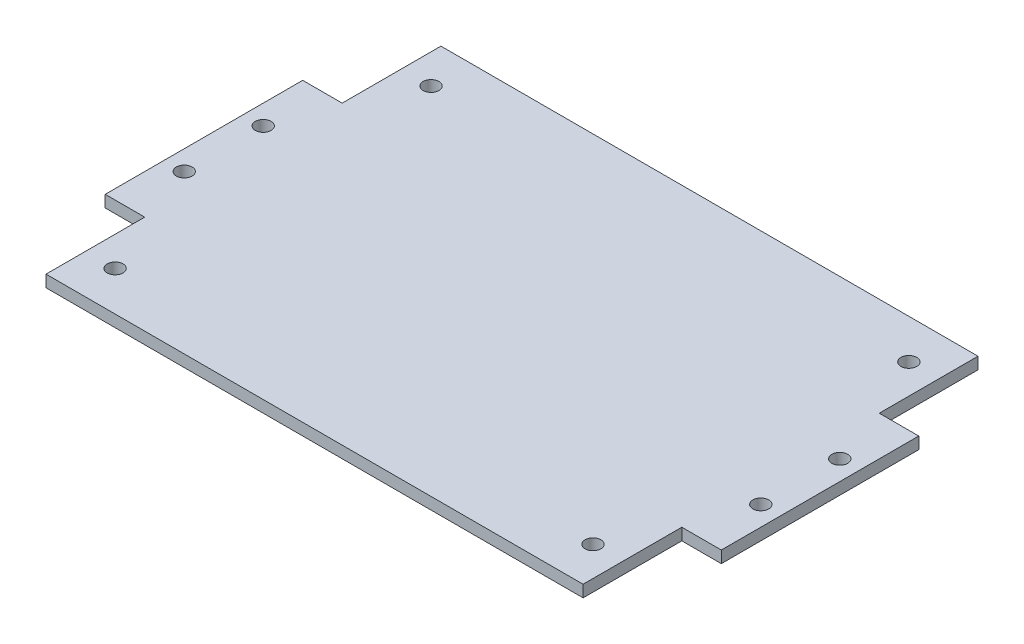
ISO-10303-21;
HEADER;
FILE_DESCRIPTION(('STEP AP214'),'2;1');
FILE_NAME('part.step','',(''),(''),'','','');
FILE_SCHEMA(('AUTOMOTIVE_DESIGN { 1 0 10303 214 1 1 1 1 }'));
ENDSEC;
DATA;
#1=APPLICATION_CONTEXT('core data for automotive mechanical design processes');
#2=APPLICATION_PROTOCOL_DEFINITION('international standard','automotive_design',2000,#1);
#3=PRODUCT_CONTEXT('',#1,'mechanical');
#4=PRODUCT('Part','Part','',(#3));
#5=PRODUCT_RELATED_PRODUCT_CATEGORY('part','',(#4));
#6=PRODUCT_DEFINITION_FORMATION('','',#4);
#7=PRODUCT_DEFINITION_CONTEXT('part definition',#1,'design');
#8=PRODUCT_DEFINITION('design','',#6,#7);
#9=PRODUCT_DEFINITION_SHAPE('','',#8);
#10=(LENGTH_UNIT() NAMED_UNIT(*) SI_UNIT(.MILLI.,.METRE.));
#11=(NAMED_UNIT(*) PLANE_ANGLE_UNIT() SI_UNIT($,.RADIAN.));
#12=(NAMED_UNIT(*) SI_UNIT($,.STERADIAN.) SOLID_ANGLE_UNIT());
#13=UNCERTAINTY_MEASURE_WITH_UNIT(LENGTH_MEASURE(1.E-05),#10,'distance_accuracy_value','');
#14=(GEOMETRIC_REPRESENTATION_CONTEXT(3) GLOBAL_UNCERTAINTY_ASSIGNED_CONTEXT((#13)) GLOBAL_UNIT_ASSIGNED_CONTEXT((#10,
#11,#12)) REPRESENTATION_CONTEXT('',''));
#15=CARTESIAN_POINT('',(0.,0.,0.));
#16=DIRECTION('',(0.,0.,1.));
#17=DIRECTION('',(1.,0.,0.));
#18=AXIS2_PLACEMENT_3D('',#15,#16,#17);
#19=CARTESIAN_POINT('',(-136.,3.,-100.));
#20=DIRECTION('',(1.,0.,0.));
#21=DIRECTION('',(0.,0.,-1.));
#22=AXIS2_PLACEMENT_3D('',#19,#20,#21);
#23=PLANE('',#22);
#24=DIRECTION('',(0.,1.,0.));
#25=VECTOR('',#24,1.);
#26=CARTESIAN_POINT('',(-136.,0.,-25.));
#27=LINE('',#26,#25);
#28=CARTESIAN_POINT('',(-136.,0.,-25.));
#29=VERTEX_POINT('',#28);
#30=CARTESIAN_POINT('',(-136.,3.,-25.));
#31=VERTEX_POINT('',#30);
#32=EDGE_CURVE('E152',#29,#31,#27,.T.);
#33=ORIENTED_EDGE('',*,*,#32,.F.);
#34=DIRECTION('',(0.,0.,1.));
#35=VECTOR('',#34,1.);
#36=CARTESIAN_POINT('',(-136.,0.,-100.));
#37=LINE('',#36,#35);
#38=CARTESIAN_POINT('',(-136.,0.,0.));
#39=VERTEX_POINT('',#38);
#40=EDGE_CURVE('E235',#29,#39,#37,.T.);
#41=ORIENTED_EDGE('',*,*,#40,.T.);
#42=DIRECTION('',(0.,-1.,0.));
#43=VECTOR('',#42,1.);
#44=CARTESIAN_POINT('',(-136.,3.,0.));
#45=LINE('',#44,#43);
#46=CARTESIAN_POINT('',(-136.,3.,0.));
#47=VERTEX_POINT('',#46);
#48=EDGE_CURVE('E11',#47,#39,#45,.T.);
#49=ORIENTED_EDGE('',*,*,#48,.F.);
#50=DIRECTION('',(0.,0.,1.));
#51=VECTOR('',#50,1.);
#52=CARTESIAN_POINT('',(-136.,3.,-100.));
#53=LINE('',#52,#51);
#54=EDGE_CURVE('E56',#31,#47,#53,.T.);
#55=ORIENTED_EDGE('',*,*,#54,.F.);
#56=EDGE_LOOP('',(#33,#41,#49,#55));
#57=FACE_BOUND('',#56,.T.);
#58=ADVANCED_FACE('F39',(#57),#23,.F.);
#59=DIRECTION('',(0.,-1.,0.));
#60=VECTOR('',#59,1.);
#61=CARTESIAN_POINT('',(-136.,0.,-75.));
#62=LINE('',#61,#60);
#63=CARTESIAN_POINT('',(-136.,3.,-75.));
#64=VERTEX_POINT('',#63);
#65=CARTESIAN_POINT('',(-136.,0.,-75.));
#66=VERTEX_POINT('',#65);
#67=EDGE_CURVE('E64',#64,#66,#62,.T.);
#68=ORIENTED_EDGE('',*,*,#67,.F.);
#69=CARTESIAN_POINT('',(-136.,3.,-100.));
#70=VERTEX_POINT('',#69);
#71=EDGE_CURVE('E155',#70,#64,#53,.T.);
#72=ORIENTED_EDGE('',*,*,#71,.F.);
#73=DIRECTION('',(0.,-1.,0.));
#74=VECTOR('',#73,1.);
#75=CARTESIAN_POINT('',(-136.,3.,-100.));
#76=LINE('',#75,#74);
#77=CARTESIAN_POINT('',(-136.,0.,-100.));
#78=VERTEX_POINT('',#77);
#79=EDGE_CURVE('E230',#70,#78,#76,.T.);
#80=ORIENTED_EDGE('',*,*,#79,.T.);
#81=EDGE_CURVE('E231',#78,#66,#37,.T.);
#82=ORIENTED_EDGE('',*,*,#81,.T.);
#83=EDGE_LOOP('',(#68,#72,#80,#82));
#84=FACE_BOUND('',#83,.T.);
#85=ADVANCED_FACE('F322',(#84),#23,.F.);
#86=CARTESIAN_POINT('',(0.,3.,-100.));
#87=DIRECTION('',(-1.,0.,0.));
#88=DIRECTION('',(0.,0.,1.));
#89=AXIS2_PLACEMENT_3D('',#86,#87,#88);
#90=PLANE('',#89);
#91=DIRECTION('',(0.,-1.,0.));
#92=VECTOR('',#91,1.);
#93=CARTESIAN_POINT('',(0.,0.,-25.));
#94=LINE('',#93,#92);
#95=CARTESIAN_POINT('',(0.,3.,-25.));
#96=VERTEX_POINT('',#95);
#97=CARTESIAN_POINT('',(0.,0.,-25.));
#98=VERTEX_POINT('',#97);
#99=EDGE_CURVE('E157',#96,#98,#94,.T.);
#100=ORIENTED_EDGE('',*,*,#99,.F.);
#101=DIRECTION('',(0.,0.,-1.));
#102=VECTOR('',#101,1.);
#103=CARTESIAN_POINT('',(0.,3.,-100.));
#104=LINE('',#103,#102);
#105=CARTESIAN_POINT('',(0.,3.,0.));
#106=VERTEX_POINT('',#105);
#107=EDGE_CURVE('E223',#106,#96,#104,.T.);
#108=ORIENTED_EDGE('',*,*,#107,.F.);
#109=DIRECTION('',(0.,-1.,0.));
#110=VECTOR('',#109,1.);
#111=CARTESIAN_POINT('',(0.,3.,0.));
#112=LINE('',#111,#110);
#113=CARTESIAN_POINT('',(0.,0.,0.));
#114=VERTEX_POINT('',#113);
#115=EDGE_CURVE('E48',#106,#114,#112,.T.);
#116=ORIENTED_EDGE('',*,*,#115,.T.);
#117=DIRECTION('',(0.,0.,-1.));
#118=VECTOR('',#117,1.);
#119=CARTESIAN_POINT('',(0.,0.,-100.));
#120=LINE('',#119,#118);
#121=EDGE_CURVE('E239',#114,#98,#120,.T.);
#122=ORIENTED_EDGE('',*,*,#121,.T.);
#123=EDGE_LOOP('',(#100,#108,#116,#122));
#124=FACE_BOUND('',#123,.T.);
#125=ADVANCED_FACE('F324',(#124),#90,.F.);
#126=DIRECTION('',(0.,1.,0.));
#127=VECTOR('',#126,1.);
#128=CARTESIAN_POINT('',(0.,0.,-75.));
#129=LINE('',#128,#127);
#130=CARTESIAN_POINT('',(0.,0.,-75.));
#131=VERTEX_POINT('',#130);
#132=CARTESIAN_POINT('',(0.,3.,-75.));
#133=VERTEX_POINT('',#132);
#134=EDGE_CURVE('E162',#131,#133,#129,.T.);
#135=ORIENTED_EDGE('',*,*,#134,.F.);
#136=CARTESIAN_POINT('',(0.,0.,-100.));
#137=VERTEX_POINT('',#136);
#138=EDGE_CURVE('E238',#131,#137,#120,.T.);
#139=ORIENTED_EDGE('',*,*,#138,.T.);
#140=DIRECTION('',(0.,-1.,0.));
#141=VECTOR('',#140,1.);
#142=CARTESIAN_POINT('',(0.,3.,-100.));
#143=LINE('',#142,#141);
#144=CARTESIAN_POINT('',(0.,3.,-100.));
#145=VERTEX_POINT('',#144);
#146=EDGE_CURVE('E248',#145,#137,#143,.T.);
#147=ORIENTED_EDGE('',*,*,#146,.F.);
#148=EDGE_CURVE('E222',#133,#145,#104,.T.);
#149=ORIENTED_EDGE('',*,*,#148,.F.);
#150=EDGE_LOOP('',(#135,#139,#147,#149));
#151=FACE_BOUND('',#150,.T.);
#152=ADVANCED_FACE('F317',(#151),#90,.F.);
#153=CARTESIAN_POINT('',(-136.,3.,0.));
#154=DIRECTION('',(0.,0.,-1.));
#155=DIRECTION('',(-1.,0.,0.));
#156=AXIS2_PLACEMENT_3D('',#153,#154,#155);
#157=PLANE('',#156);
#158=DIRECTION('',(1.,0.,0.));
#159=VECTOR('',#158,1.);
#160=CARTESIAN_POINT('',(-136.,0.,0.));
#161=LINE('',#160,#159);
#162=EDGE_CURVE('E234',#39,#114,#161,.T.);
#163=ORIENTED_EDGE('',*,*,#162,.T.);
#164=ORIENTED_EDGE('',*,*,#115,.F.);
#165=DIRECTION('',(1.,0.,0.));
#166=VECTOR('',#165,1.);
#167=CARTESIAN_POINT('',(-136.,3.,0.));
#168=LINE('',#167,#166);
#169=EDGE_CURVE('E219',#47,#106,#168,.T.);
#170=ORIENTED_EDGE('',*,*,#169,.F.);
#171=ORIENTED_EDGE('',*,*,#48,.T.);
#172=EDGE_LOOP('',(#163,#164,#170,#171));
#173=FACE_BOUND('',#172,.T.);
#174=ADVANCED_FACE('F375',(#173),#157,.F.);
#175=CARTESIAN_POINT('',(-136.,3.,-100.));
#176=DIRECTION('',(0.,0.,1.));
#177=DIRECTION('',(1.,0.,0.));
#178=AXIS2_PLACEMENT_3D('',#175,#176,#177);
#179=PLANE('',#178);
#180=DIRECTION('',(-1.,0.,0.));
#181=VECTOR('',#180,1.);
#182=CARTESIAN_POINT('',(-136.,0.,-100.));
#183=LINE('',#182,#181);
#184=EDGE_CURVE('E242',#137,#78,#183,.T.);
#185=ORIENTED_EDGE('',*,*,#184,.T.);
#186=ORIENTED_EDGE('',*,*,#79,.F.);
#187=DIRECTION('',(-1.,0.,0.));
#188=VECTOR('',#187,1.);
#189=CARTESIAN_POINT('',(-136.,3.,-100.));
#190=LINE('',#189,#188);
#191=EDGE_CURVE('E227',#145,#70,#190,.T.);
#192=ORIENTED_EDGE('',*,*,#191,.F.);
#193=ORIENTED_EDGE('',*,*,#146,.T.);
#194=EDGE_LOOP('',(#185,#186,#192,#193));
#195=FACE_BOUND('',#194,.T.);
#196=ADVANCED_FACE('F321',(#195),#179,.F.);
#197=CARTESIAN_POINT('',(0.,3.,0.));
#198=DIRECTION('',(0.,1.,0.));
#199=DIRECTION('',(0.,0.,1.));
#200=AXIS2_PLACEMENT_3D('',#197,#198,#199);
#201=PLANE('',#200);
#202=CARTESIAN_POINT('',(-141.,3.,-40.));
#203=DIRECTION('',(0.,1.,0.));
#204=DIRECTION('',(0.,0.,1.));
#205=AXIS2_PLACEMENT_3D('',#202,#203,#204);
#206=CIRCLE('',#205,2.);
#207=CARTESIAN_POINT('',(-141.,3.,-38.));
#208=VERTEX_POINT('',#207);
#209=EDGE_CURVE('E499',#208,#208,#206,.T.);
#210=ORIENTED_EDGE('',*,*,#209,.F.);
#211=EDGE_LOOP('',(#210));
#212=FACE_BOUND('',#211,.T.);
#213=CARTESIAN_POINT('',(-141.,3.,-60.));
#214=DIRECTION('',(0.,1.,0.));
#215=DIRECTION('',(0.,0.,1.));
#216=AXIS2_PLACEMENT_3D('',#213,#214,#215);
#217=CIRCLE('',#216,2.);
#218=CARTESIAN_POINT('',(-141.,3.,-58.));
#219=VERTEX_POINT('',#218);
#220=EDGE_CURVE('E492',#219,#219,#217,.T.);
#221=ORIENTED_EDGE('',*,*,#220,.F.);
#222=EDGE_LOOP('',(#221));
#223=FACE_BOUND('',#222,.T.);
#224=CARTESIAN_POINT('',(5.,3.,-60.));
#225=DIRECTION('',(0.,1.,0.));
#226=DIRECTION('',(0.,0.,1.));
#227=AXIS2_PLACEMENT_3D('',#224,#225,#226);
#228=CIRCLE('',#227,2.);
#229=CARTESIAN_POINT('',(5.,3.,-58.));
#230=VERTEX_POINT('',#229);
#231=EDGE_CURVE('E472',#230,#230,#228,.T.);
#232=ORIENTED_EDGE('',*,*,#231,.F.);
#233=EDGE_LOOP('',(#232));
#234=FACE_BOUND('',#233,.T.);
#235=CARTESIAN_POINT('',(5.,3.,-40.));
#236=DIRECTION('',(0.,1.,0.));
#237=DIRECTION('',(0.,0.,1.));
#238=AXIS2_PLACEMENT_3D('',#235,#236,#237);
#239=CIRCLE('',#238,2.);
#240=CARTESIAN_POINT('',(5.,3.,-38.));
#241=VERTEX_POINT('',#240);
#242=EDGE_CURVE('E275',#241,#241,#239,.T.);
#243=ORIENTED_EDGE('',*,*,#242,.F.);
#244=EDGE_LOOP('',(#243));
#245=FACE_BOUND('',#244,.T.);
#246=CARTESIAN_POINT('',(-7.5,3.,-90.));
#247=DIRECTION('',(0.,1.,0.));
#248=DIRECTION('',(0.,0.,1.));
#249=AXIS2_PLACEMENT_3D('',#246,#247,#248);
#250=CIRCLE('',#249,2.);
#251=CARTESIAN_POINT('',(-7.5,3.,-88.));
#252=VERTEX_POINT('',#251);
#253=EDGE_CURVE('E200',#252,#252,#250,.T.);
#254=ORIENTED_EDGE('',*,*,#253,.F.);
#255=EDGE_LOOP('',(#254));
#256=FACE_BOUND('',#255,.T.);
#257=CARTESIAN_POINT('',(-7.5,3.,-10.));
#258=DIRECTION('',(0.,1.,0.));
#259=DIRECTION('',(0.,0.,1.));
#260=AXIS2_PLACEMENT_3D('',#257,#258,#259);
#261=CIRCLE('',#260,2.);
#262=CARTESIAN_POINT('',(-7.5,3.,-8.));
#263=VERTEX_POINT('',#262);
#264=EDGE_CURVE('E206',#263,#263,#261,.T.);
#265=ORIENTED_EDGE('',*,*,#264,.F.);
#266=EDGE_LOOP('',(#265));
#267=FACE_BOUND('',#266,.T.);
#268=CARTESIAN_POINT('',(-128.5,3.,-10.));
#269=DIRECTION('',(0.,1.,0.));
#270=DIRECTION('',(0.,0.,1.));
#271=AXIS2_PLACEMENT_3D('',#268,#269,#270);
#272=CIRCLE('',#271,2.);
#273=CARTESIAN_POINT('',(-128.5,3.,-8.));
#274=VERTEX_POINT('',#273);
#275=EDGE_CURVE('E201',#274,#274,#272,.T.);
#276=ORIENTED_EDGE('',*,*,#275,.F.);
#277=EDGE_LOOP('',(#276));
#278=FACE_BOUND('',#277,.T.);
#279=CARTESIAN_POINT('',(-128.5,3.,-90.));
#280=DIRECTION('',(0.,1.,0.));
#281=DIRECTION('',(0.,0.,1.));
#282=AXIS2_PLACEMENT_3D('',#279,#280,#281);
#283=CIRCLE('',#282,2.);
#284=CARTESIAN_POINT('',(-128.5,3.,-88.));
#285=VERTEX_POINT('',#284);
#286=EDGE_CURVE('E205',#285,#285,#283,.T.);
#287=ORIENTED_EDGE('',*,*,#286,.F.);
#288=EDGE_LOOP('',(#287));
#289=FACE_BOUND('',#288,.T.);
#290=ORIENTED_EDGE('',*,*,#71,.T.);
#291=DIRECTION('',(1.,0.,0.));
#292=VECTOR('',#291,1.);
#293=CARTESIAN_POINT('',(-146.,3.,-75.));
#294=LINE('',#293,#292);
#295=CARTESIAN_POINT('',(-146.,3.,-75.));
#296=VERTEX_POINT('',#295);
#297=EDGE_CURVE('E135',#296,#64,#294,.T.);
#298=ORIENTED_EDGE('',*,*,#297,.F.);
#299=DIRECTION('',(0.,0.,-1.));
#300=VECTOR('',#299,1.);
#301=CARTESIAN_POINT('',(-146.,3.,-75.));
#302=LINE('',#301,#300);
#303=CARTESIAN_POINT('',(-146.,3.,-25.));
#304=VERTEX_POINT('',#303);
#305=EDGE_CURVE('E142',#304,#296,#302,.T.);
#306=ORIENTED_EDGE('',*,*,#305,.F.);
#307=DIRECTION('',(1.,0.,0.));
#308=VECTOR('',#307,1.);
#309=CARTESIAN_POINT('',(-146.,3.,-25.));
#310=LINE('',#309,#308);
#311=EDGE_CURVE('E294',#304,#31,#310,.T.);
#312=ORIENTED_EDGE('',*,*,#311,.T.);
#313=ORIENTED_EDGE('',*,*,#54,.T.);
#314=ORIENTED_EDGE('',*,*,#169,.T.);
#315=ORIENTED_EDGE('',*,*,#107,.T.);
#316=DIRECTION('',(-1.,0.,0.));
#317=VECTOR('',#316,1.);
#318=CARTESIAN_POINT('',(10.,3.,-25.));
#319=LINE('',#318,#317);
#320=CARTESIAN_POINT('',(10.,3.,-25.));
#321=VERTEX_POINT('',#320);
#322=EDGE_CURVE('E180',#321,#96,#319,.T.);
#323=ORIENTED_EDGE('',*,*,#322,.F.);
#324=DIRECTION('',(0.,0.,1.));
#325=VECTOR('',#324,1.);
#326=CARTESIAN_POINT('',(10.,3.,-25.));
#327=LINE('',#326,#325);
#328=CARTESIAN_POINT('',(10.,3.,-75.));
#329=VERTEX_POINT('',#328);
#330=EDGE_CURVE('E178',#329,#321,#327,.T.);
#331=ORIENTED_EDGE('',*,*,#330,.F.);
#332=DIRECTION('',(-1.,0.,0.));
#333=VECTOR('',#332,1.);
#334=CARTESIAN_POINT('',(10.,3.,-75.));
#335=LINE('',#334,#333);
#336=EDGE_CURVE('E188',#329,#133,#335,.T.);
#337=ORIENTED_EDGE('',*,*,#336,.T.);
#338=ORIENTED_EDGE('',*,*,#148,.T.);
#339=ORIENTED_EDGE('',*,*,#191,.T.);
#340=EDGE_LOOP('',(#290,#298,#306,#312,#313,#314,#315,#323,#331,#337,#338,#339));
#341=FACE_BOUND('',#340,.T.);
#342=ADVANCED_FACE('F154',(#212,#223,#234,#245,#256,#267,#278,#289,#341),#201,.T.);
#343=CARTESIAN_POINT('',(0.,0.,0.));
#344=DIRECTION('',(0.,1.,0.));
#345=DIRECTION('',(0.,0.,1.));
#346=AXIS2_PLACEMENT_3D('',#343,#344,#345);
#347=PLANE('',#346);
#348=CARTESIAN_POINT('',(-141.,0.,-40.));
#349=DIRECTION('',(0.,1.,0.));
#350=DIRECTION('',(0.,0.,1.));
#351=AXIS2_PLACEMENT_3D('',#348,#349,#350);
#352=CIRCLE('',#351,2.);
#353=CARTESIAN_POINT('',(-141.,0.,-38.));
#354=VERTEX_POINT('',#353);
#355=EDGE_CURVE('E42',#354,#354,#352,.T.);
#356=ORIENTED_EDGE('',*,*,#355,.T.);
#357=EDGE_LOOP('',(#356));
#358=FACE_BOUND('',#357,.T.);
#359=CARTESIAN_POINT('',(-141.,0.,-60.));
#360=DIRECTION('',(0.,1.,0.));
#361=DIRECTION('',(0.,0.,1.));
#362=AXIS2_PLACEMENT_3D('',#359,#360,#361);
#363=CIRCLE('',#362,2.);
#364=CARTESIAN_POINT('',(-141.,0.,-58.));
#365=VERTEX_POINT('',#364);
#366=EDGE_CURVE('E278',#365,#365,#363,.T.);
#367=ORIENTED_EDGE('',*,*,#366,.T.);
#368=EDGE_LOOP('',(#367));
#369=FACE_BOUND('',#368,.T.);
#370=CARTESIAN_POINT('',(5.,0.,-60.));
#371=DIRECTION('',(0.,1.,0.));
#372=DIRECTION('',(0.,0.,1.));
#373=AXIS2_PLACEMENT_3D('',#370,#371,#372);
#374=CIRCLE('',#373,2.);
#375=CARTESIAN_POINT('',(5.,0.,-58.));
#376=VERTEX_POINT('',#375);
#377=EDGE_CURVE('E274',#376,#376,#374,.T.);
#378=ORIENTED_EDGE('',*,*,#377,.T.);
#379=EDGE_LOOP('',(#378));
#380=FACE_BOUND('',#379,.T.);
#381=CARTESIAN_POINT('',(5.,0.,-40.));
#382=DIRECTION('',(0.,1.,0.));
#383=DIRECTION('',(0.,0.,1.));
#384=AXIS2_PLACEMENT_3D('',#381,#382,#383);
#385=CIRCLE('',#384,2.);
#386=CARTESIAN_POINT('',(5.,0.,-38.));
#387=VERTEX_POINT('',#386);
#388=EDGE_CURVE('E270',#387,#387,#385,.T.);
#389=ORIENTED_EDGE('',*,*,#388,.T.);
#390=EDGE_LOOP('',(#389));
#391=FACE_BOUND('',#390,.T.);
#392=CARTESIAN_POINT('',(-7.5,0.,-90.));
#393=DIRECTION('',(0.,1.,0.));
#394=DIRECTION('',(0.,0.,1.));
#395=AXIS2_PLACEMENT_3D('',#392,#393,#394);
#396=CIRCLE('',#395,2.);
#397=CARTESIAN_POINT('',(-7.5,0.,-88.));
#398=VERTEX_POINT('',#397);
#399=EDGE_CURVE('E266',#398,#398,#396,.T.);
#400=ORIENTED_EDGE('',*,*,#399,.T.);
#401=EDGE_LOOP('',(#400));
#402=FACE_BOUND('',#401,.T.);
#403=CARTESIAN_POINT('',(-7.5,0.,-10.));
#404=DIRECTION('',(0.,1.,0.));
#405=DIRECTION('',(0.,0.,1.));
#406=AXIS2_PLACEMENT_3D('',#403,#404,#405);
#407=CIRCLE('',#406,2.);
#408=CARTESIAN_POINT('',(-7.5,0.,-8.));
#409=VERTEX_POINT('',#408);
#410=EDGE_CURVE('E262',#409,#409,#407,.T.);
#411=ORIENTED_EDGE('',*,*,#410,.T.);
#412=EDGE_LOOP('',(#411));
#413=FACE_BOUND('',#412,.T.);
#414=CARTESIAN_POINT('',(-128.5,0.,-10.));
#415=DIRECTION('',(0.,1.,0.));
#416=DIRECTION('',(0.,0.,1.));
#417=AXIS2_PLACEMENT_3D('',#414,#415,#416);
#418=CIRCLE('',#417,2.);
#419=CARTESIAN_POINT('',(-128.5,0.,-8.));
#420=VERTEX_POINT('',#419);
#421=EDGE_CURVE('E258',#420,#420,#418,.T.);
#422=ORIENTED_EDGE('',*,*,#421,.T.);
#423=EDGE_LOOP('',(#422));
#424=FACE_BOUND('',#423,.T.);
#425=CARTESIAN_POINT('',(-128.5,0.,-90.));
#426=DIRECTION('',(0.,1.,0.));
#427=DIRECTION('',(0.,0.,1.));
#428=AXIS2_PLACEMENT_3D('',#425,#426,#427);
#429=CIRCLE('',#428,2.);
#430=CARTESIAN_POINT('',(-128.5,0.,-88.));
#431=VERTEX_POINT('',#430);
#432=EDGE_CURVE('E216',#431,#431,#429,.T.);
#433=ORIENTED_EDGE('',*,*,#432,.T.);
#434=EDGE_LOOP('',(#433));
#435=FACE_BOUND('',#434,.T.);
#436=ORIENTED_EDGE('',*,*,#81,.F.);
#437=ORIENTED_EDGE('',*,*,#184,.F.);
#438=ORIENTED_EDGE('',*,*,#138,.F.);
#439=DIRECTION('',(-1.,0.,0.));
#440=VECTOR('',#439,1.);
#441=CARTESIAN_POINT('',(10.,0.,-75.));
#442=LINE('',#441,#440);
#443=CARTESIAN_POINT('',(10.,0.,-75.));
#444=VERTEX_POINT('',#443);
#445=EDGE_CURVE('E192',#444,#131,#442,.T.);
#446=ORIENTED_EDGE('',*,*,#445,.F.);
#447=DIRECTION('',(0.,0.,-1.));
#448=VECTOR('',#447,1.);
#449=CARTESIAN_POINT('',(10.,0.,-25.));
#450=LINE('',#449,#448);
#451=CARTESIAN_POINT('',(10.,0.,-25.));
#452=VERTEX_POINT('',#451);
#453=EDGE_CURVE('E172',#452,#444,#450,.T.);
#454=ORIENTED_EDGE('',*,*,#453,.F.);
#455=DIRECTION('',(-1.,0.,0.));
#456=VECTOR('',#455,1.);
#457=CARTESIAN_POINT('',(10.,0.,-25.));
#458=LINE('',#457,#456);
#459=EDGE_CURVE('E196',#452,#98,#458,.T.);
#460=ORIENTED_EDGE('',*,*,#459,.T.);
#461=ORIENTED_EDGE('',*,*,#121,.F.);
#462=ORIENTED_EDGE('',*,*,#162,.F.);
#463=ORIENTED_EDGE('',*,*,#40,.F.);
#464=DIRECTION('',(1.,0.,0.));
#465=VECTOR('',#464,1.);
#466=CARTESIAN_POINT('',(-146.,0.,-25.));
#467=LINE('',#466,#465);
#468=CARTESIAN_POINT('',(-146.,0.,-25.));
#469=VERTEX_POINT('',#468);
#470=EDGE_CURVE('E164',#469,#29,#467,.T.);
#471=ORIENTED_EDGE('',*,*,#470,.F.);
#472=DIRECTION('',(0.,0.,1.));
#473=VECTOR('',#472,1.);
#474=CARTESIAN_POINT('',(-146.,0.,-75.));
#475=LINE('',#474,#473);
#476=CARTESIAN_POINT('',(-146.,0.,-75.));
#477=VERTEX_POINT('',#476);
#478=EDGE_CURVE('E141',#477,#469,#475,.T.);
#479=ORIENTED_EDGE('',*,*,#478,.F.);
#480=DIRECTION('',(1.,0.,0.));
#481=VECTOR('',#480,1.);
#482=CARTESIAN_POINT('',(-146.,0.,-75.));
#483=LINE('',#482,#481);
#484=EDGE_CURVE('E137',#477,#66,#483,.T.);
#485=ORIENTED_EDGE('',*,*,#484,.T.);
#486=EDGE_LOOP('',(#436,#437,#438,#446,#454,#460,#461,#462,#463,#471,#479,#485));
#487=FACE_BOUND('',#486,.T.);
#488=ADVANCED_FACE('F304',(#358,#369,#380,#391,#402,#413,#424,#435,#487),#347,.F.);
#489=CARTESIAN_POINT('',(-128.5,-7.,-90.));
#490=DIRECTION('',(0.,1.,0.));
#491=DIRECTION('',(0.,0.,1.));
#492=AXIS2_PLACEMENT_3D('',#489,#490,#491);
#493=CYLINDRICAL_SURFACE('',#492,2.);
#494=ORIENTED_EDGE('',*,*,#286,.T.);
#495=EDGE_LOOP('',(#494));
#496=FACE_BOUND('',#495,.T.);
#497=ORIENTED_EDGE('',*,*,#432,.F.);
#498=EDGE_LOOP('',(#497));
#499=FACE_BOUND('',#498,.T.);
#500=ADVANCED_FACE('F410',(#496,#499),#493,.F.);
#501=CARTESIAN_POINT('',(-128.5,-7.,-10.));
#502=DIRECTION('',(0.,1.,0.));
#503=DIRECTION('',(0.,0.,1.));
#504=AXIS2_PLACEMENT_3D('',#501,#502,#503);
#505=CYLINDRICAL_SURFACE('',#504,2.);
#506=ORIENTED_EDGE('',*,*,#275,.T.);
#507=EDGE_LOOP('',(#506));
#508=FACE_BOUND('',#507,.T.);
#509=ORIENTED_EDGE('',*,*,#421,.F.);
#510=EDGE_LOOP('',(#509));
#511=FACE_BOUND('',#510,.T.);
#512=ADVANCED_FACE('F400',(#508,#511),#505,.F.);
#513=CARTESIAN_POINT('',(-7.5,-7.,-10.));
#514=DIRECTION('',(0.,1.,0.));
#515=DIRECTION('',(0.,0.,1.));
#516=AXIS2_PLACEMENT_3D('',#513,#514,#515);
#517=CYLINDRICAL_SURFACE('',#516,2.);
#518=ORIENTED_EDGE('',*,*,#264,.T.);
#519=EDGE_LOOP('',(#518));
#520=FACE_BOUND('',#519,.T.);
#521=ORIENTED_EDGE('',*,*,#410,.F.);
#522=EDGE_LOOP('',(#521));
#523=FACE_BOUND('',#522,.T.);
#524=ADVANCED_FACE('F390',(#520,#523),#517,.F.);
#525=CARTESIAN_POINT('',(-7.5,-7.,-90.));
#526=DIRECTION('',(0.,1.,0.));
#527=DIRECTION('',(0.,0.,1.));
#528=AXIS2_PLACEMENT_3D('',#525,#526,#527);
#529=CYLINDRICAL_SURFACE('',#528,2.);
#530=ORIENTED_EDGE('',*,*,#253,.T.);
#531=EDGE_LOOP('',(#530));
#532=FACE_BOUND('',#531,.T.);
#533=ORIENTED_EDGE('',*,*,#399,.F.);
#534=EDGE_LOOP('',(#533));
#535=FACE_BOUND('',#534,.T.);
#536=ADVANCED_FACE('F365',(#532,#535),#529,.F.);
#537=CARTESIAN_POINT('',(10.,0.,-25.));
#538=DIRECTION('',(0.,0.,-1.));
#539=DIRECTION('',(-1.,0.,0.));
#540=AXIS2_PLACEMENT_3D('',#537,#538,#539);
#541=PLANE('',#540);
#542=ORIENTED_EDGE('',*,*,#99,.T.);
#543=ORIENTED_EDGE('',*,*,#459,.F.);
#544=DIRECTION('',(0.,-1.,0.));
#545=VECTOR('',#544,1.);
#546=CARTESIAN_POINT('',(10.,0.,-25.));
#547=LINE('',#546,#545);
#548=EDGE_CURVE('E168',#321,#452,#547,.T.);
#549=ORIENTED_EDGE('',*,*,#548,.F.);
#550=ORIENTED_EDGE('',*,*,#322,.T.);
#551=EDGE_LOOP('',(#542,#543,#549,#550));
#552=FACE_BOUND('',#551,.T.);
#553=ADVANCED_FACE('F355',(#552),#541,.F.);
#554=CARTESIAN_POINT('',(10.,0.,-75.));
#555=DIRECTION('',(0.,0.,1.));
#556=DIRECTION('',(1.,0.,0.));
#557=AXIS2_PLACEMENT_3D('',#554,#555,#556);
#558=PLANE('',#557);
#559=ORIENTED_EDGE('',*,*,#134,.T.);
#560=ORIENTED_EDGE('',*,*,#336,.F.);
#561=DIRECTION('',(0.,1.,0.));
#562=VECTOR('',#561,1.);
#563=CARTESIAN_POINT('',(10.,0.,-75.));
#564=LINE('',#563,#562);
#565=EDGE_CURVE('E175',#444,#329,#564,.T.);
#566=ORIENTED_EDGE('',*,*,#565,.F.);
#567=ORIENTED_EDGE('',*,*,#445,.T.);
#568=EDGE_LOOP('',(#559,#560,#566,#567));
#569=FACE_BOUND('',#568,.T.);
#570=ADVANCED_FACE('F344',(#569),#558,.F.);
#571=CARTESIAN_POINT('',(10.,0.,0.));
#572=DIRECTION('',(-1.,0.,0.));
#573=DIRECTION('',(0.,0.,1.));
#574=AXIS2_PLACEMENT_3D('',#571,#572,#573);
#575=PLANE('',#574);
#576=ORIENTED_EDGE('',*,*,#548,.T.);
#577=ORIENTED_EDGE('',*,*,#453,.T.);
#578=ORIENTED_EDGE('',*,*,#565,.T.);
#579=ORIENTED_EDGE('',*,*,#330,.T.);
#580=EDGE_LOOP('',(#576,#577,#578,#579));
#581=FACE_BOUND('',#580,.T.);
#582=ADVANCED_FACE('F339',(#581),#575,.F.);
#583=CARTESIAN_POINT('',(-146.,0.,-75.));
#584=DIRECTION('',(0.,0.,1.));
#585=DIRECTION('',(1.,0.,0.));
#586=AXIS2_PLACEMENT_3D('',#583,#584,#585);
#587=PLANE('',#586);
#588=ORIENTED_EDGE('',*,*,#67,.T.);
#589=ORIENTED_EDGE('',*,*,#484,.F.);
#590=DIRECTION('',(0.,-1.,0.));
#591=VECTOR('',#590,1.);
#592=CARTESIAN_POINT('',(-146.,0.,-75.));
#593=LINE('',#592,#591);
#594=EDGE_CURVE('E131',#296,#477,#593,.T.);
#595=ORIENTED_EDGE('',*,*,#594,.F.);
#596=ORIENTED_EDGE('',*,*,#297,.T.);
#597=EDGE_LOOP('',(#588,#589,#595,#596));
#598=FACE_BOUND('',#597,.T.);
#599=ADVANCED_FACE('F133',(#598),#587,.F.);
#600=CARTESIAN_POINT('',(-146.,0.,-25.));
#601=DIRECTION('',(0.,0.,-1.));
#602=DIRECTION('',(-1.,0.,0.));
#603=AXIS2_PLACEMENT_3D('',#600,#601,#602);
#604=PLANE('',#603);
#605=ORIENTED_EDGE('',*,*,#32,.T.);
#606=ORIENTED_EDGE('',*,*,#311,.F.);
#607=DIRECTION('',(0.,1.,0.));
#608=VECTOR('',#607,1.);
#609=CARTESIAN_POINT('',(-146.,0.,-25.));
#610=LINE('',#609,#608);
#611=EDGE_CURVE('E147',#469,#304,#610,.T.);
#612=ORIENTED_EDGE('',*,*,#611,.F.);
#613=ORIENTED_EDGE('',*,*,#470,.T.);
#614=EDGE_LOOP('',(#605,#606,#612,#613));
#615=FACE_BOUND('',#614,.T.);
#616=ADVANCED_FACE('F300',(#615),#604,.F.);
#617=CARTESIAN_POINT('',(-146.,0.,0.));
#618=DIRECTION('',(-1.,0.,0.));
#619=DIRECTION('',(0.,0.,1.));
#620=AXIS2_PLACEMENT_3D('',#617,#618,#619);
#621=PLANE('',#620);
#622=ORIENTED_EDGE('',*,*,#305,.T.);
#623=ORIENTED_EDGE('',*,*,#594,.T.);
#624=ORIENTED_EDGE('',*,*,#478,.T.);
#625=ORIENTED_EDGE('',*,*,#611,.T.);
#626=EDGE_LOOP('',(#622,#623,#624,#625));
#627=FACE_BOUND('',#626,.T.);
#628=ADVANCED_FACE('F145',(#627),#621,.T.);
#629=CARTESIAN_POINT('',(5.,-7.,-40.));
#630=DIRECTION('',(0.,1.,0.));
#631=DIRECTION('',(0.,0.,1.));
#632=AXIS2_PLACEMENT_3D('',#629,#630,#631);
#633=CYLINDRICAL_SURFACE('',#632,2.);
#634=ORIENTED_EDGE('',*,*,#242,.T.);
#635=EDGE_LOOP('',(#634));
#636=FACE_BOUND('',#635,.T.);
#637=ORIENTED_EDGE('',*,*,#388,.F.);
#638=EDGE_LOOP('',(#637));
#639=FACE_BOUND('',#638,.T.);
#640=ADVANCED_FACE('F452',(#636,#639),#633,.F.);
#641=CARTESIAN_POINT('',(5.,-7.,-60.));
#642=DIRECTION('',(0.,1.,0.));
#643=DIRECTION('',(0.,0.,1.));
#644=AXIS2_PLACEMENT_3D('',#641,#642,#643);
#645=CYLINDRICAL_SURFACE('',#644,2.);
#646=ORIENTED_EDGE('',*,*,#231,.T.);
#647=EDGE_LOOP('',(#646));
#648=FACE_BOUND('',#647,.T.);
#649=ORIENTED_EDGE('',*,*,#377,.F.);
#650=EDGE_LOOP('',(#649));
#651=FACE_BOUND('',#650,.T.);
#652=ADVANCED_FACE('F455',(#648,#651),#645,.F.);
#653=CARTESIAN_POINT('',(-141.,-7.,-60.));
#654=DIRECTION('',(0.,1.,0.));
#655=DIRECTION('',(0.,0.,1.));
#656=AXIS2_PLACEMENT_3D('',#653,#654,#655);
#657=CYLINDRICAL_SURFACE('',#656,2.);
#658=ORIENTED_EDGE('',*,*,#220,.T.);
#659=EDGE_LOOP('',(#658));
#660=FACE_BOUND('',#659,.T.);
#661=ORIENTED_EDGE('',*,*,#366,.F.);
#662=EDGE_LOOP('',(#661));
#663=FACE_BOUND('',#662,.T.);
#664=ADVANCED_FACE('F460',(#660,#663),#657,.F.);
#665=CARTESIAN_POINT('',(-141.,-7.,-40.));
#666=DIRECTION('',(0.,1.,0.));
#667=DIRECTION('',(0.,0.,1.));
#668=AXIS2_PLACEMENT_3D('',#665,#666,#667);
#669=CYLINDRICAL_SURFACE('',#668,2.);
#670=ORIENTED_EDGE('',*,*,#209,.T.);
#671=EDGE_LOOP('',(#670));
#672=FACE_BOUND('',#671,.T.);
#673=ORIENTED_EDGE('',*,*,#355,.F.);
#674=EDGE_LOOP('',(#673));
#675=FACE_BOUND('',#674,.T.);
#676=ADVANCED_FACE('F457',(#672,#675),#669,.F.);
#677=CLOSED_SHELL('',(#58,#85,#125,#152,#174,#196,#342,#488,#500,#512,#524,#536,#553,#570,#582,
#599,#616,#628,#640,#652,#664,#676));
#678=MANIFOLD_SOLID_BREP('B2',#677);
#679=ADVANCED_BREP_SHAPE_REPRESENTATION('',(#18,#678),#14);
#680=SHAPE_DEFINITION_REPRESENTATION(#9,#679);
ENDSEC;
END-ISO-10303-21;
